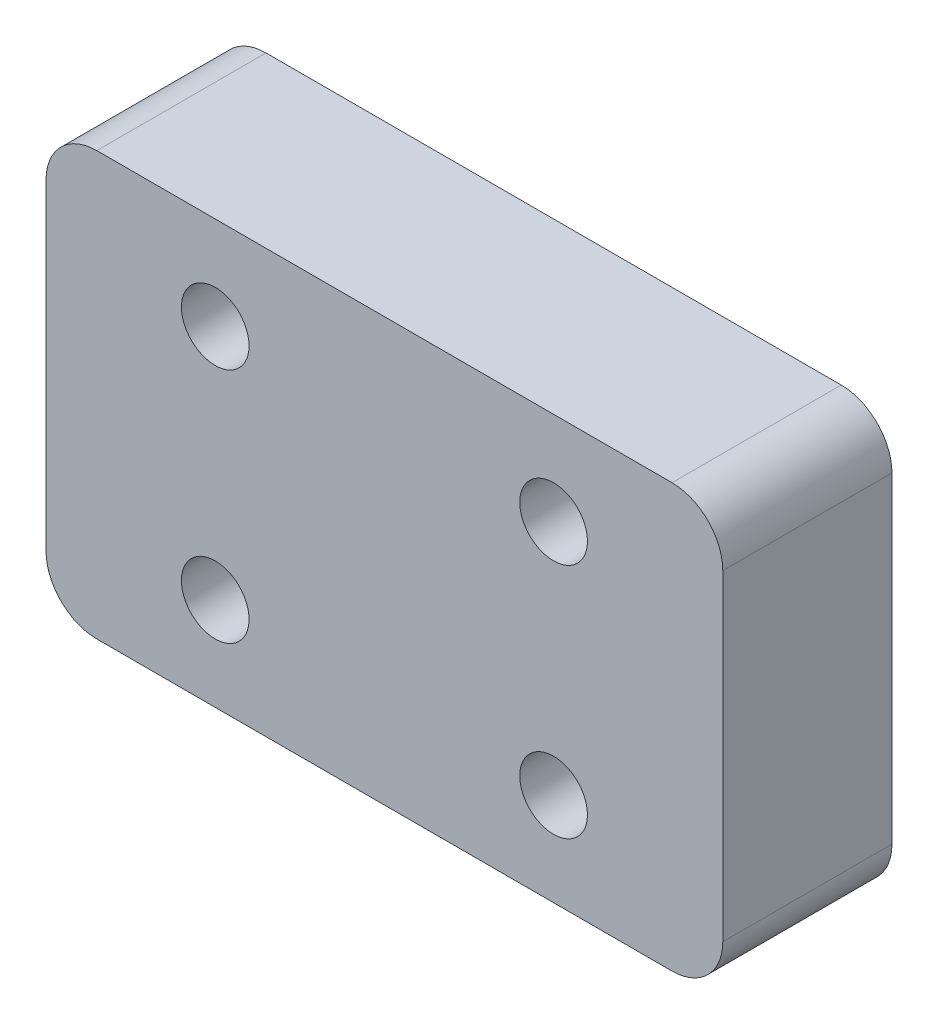
ISO-10303-21;
HEADER;
FILE_DESCRIPTION(('STEP AP214'),'2;1');
FILE_NAME('part.step','',(''),(''),'','','');
FILE_SCHEMA(('AUTOMOTIVE_DESIGN { 1 0 10303 214 1 1 1 1 }'));
ENDSEC;
DATA;
#1=APPLICATION_CONTEXT('core data for automotive mechanical design processes');
#2=APPLICATION_PROTOCOL_DEFINITION('international standard','automotive_design',2000,#1);
#3=PRODUCT_CONTEXT('',#1,'mechanical');
#4=PRODUCT('Part','Part','',(#3));
#5=PRODUCT_RELATED_PRODUCT_CATEGORY('part','',(#4));
#6=PRODUCT_DEFINITION_FORMATION('','',#4);
#7=PRODUCT_DEFINITION_CONTEXT('part definition',#1,'design');
#8=PRODUCT_DEFINITION('design','',#6,#7);
#9=PRODUCT_DEFINITION_SHAPE('','',#8);
#10=(LENGTH_UNIT() NAMED_UNIT(*) SI_UNIT(.MILLI.,.METRE.));
#11=(NAMED_UNIT(*) PLANE_ANGLE_UNIT() SI_UNIT($,.RADIAN.));
#12=(NAMED_UNIT(*) SI_UNIT($,.STERADIAN.) SOLID_ANGLE_UNIT());
#13=UNCERTAINTY_MEASURE_WITH_UNIT(LENGTH_MEASURE(1.E-05),#10,'distance_accuracy_value','');
#14=(GEOMETRIC_REPRESENTATION_CONTEXT(3) GLOBAL_UNCERTAINTY_ASSIGNED_CONTEXT((#13)) GLOBAL_UNIT_ASSIGNED_CONTEXT((#10,
#11,#12)) REPRESENTATION_CONTEXT('',''));
#15=CARTESIAN_POINT('',(0.,0.,0.));
#16=DIRECTION('',(0.,0.,1.));
#17=DIRECTION('',(1.,0.,0.));
#18=AXIS2_PLACEMENT_3D('',#15,#16,#17);
#19=CARTESIAN_POINT('',(-3.,22.,10.));
#20=DIRECTION('',(0.,0.,-1.));
#21=DIRECTION('',(-1.,0.,0.));
#22=AXIS2_PLACEMENT_3D('',#19,#20,#21);
#23=CYLINDRICAL_SURFACE('',#22,3.);
#24=CARTESIAN_POINT('',(-3.,22.,0.));
#25=DIRECTION('',(0.,0.,1.));
#26=DIRECTION('',(-1.,0.,0.));
#27=AXIS2_PLACEMENT_3D('',#24,#25,#26);
#28=CIRCLE('',#27,3.);
#29=CARTESIAN_POINT('',(0.,22.,0.));
#30=VERTEX_POINT('',#29);
#31=CARTESIAN_POINT('',(-3.,25.,0.));
#32=VERTEX_POINT('',#31);
#33=EDGE_CURVE('E137',#30,#32,#28,.T.);
#34=ORIENTED_EDGE('',*,*,#33,.T.);
#35=DIRECTION('',(0.,0.,-1.));
#36=VECTOR('',#35,1.);
#37=CARTESIAN_POINT('',(-3.,25.,10.));
#38=LINE('',#37,#36);
#39=CARTESIAN_POINT('',(-3.,25.,10.));
#40=VERTEX_POINT('',#39);
#41=EDGE_CURVE('E11',#40,#32,#38,.T.);
#42=ORIENTED_EDGE('',*,*,#41,.F.);
#43=CARTESIAN_POINT('',(-3.,22.,10.));
#44=DIRECTION('',(0.,0.,1.));
#45=DIRECTION('',(-1.,0.,0.));
#46=AXIS2_PLACEMENT_3D('',#43,#44,#45);
#47=CIRCLE('',#46,3.);
#48=CARTESIAN_POINT('',(0.,22.,10.));
#49=VERTEX_POINT('',#48);
#50=EDGE_CURVE('E152',#49,#40,#47,.T.);
#51=ORIENTED_EDGE('',*,*,#50,.F.);
#52=DIRECTION('',(0.,0.,-1.));
#53=VECTOR('',#52,1.);
#54=CARTESIAN_POINT('',(0.,22.,10.));
#55=LINE('',#54,#53);
#56=EDGE_CURVE('E133',#49,#30,#55,.T.);
#57=ORIENTED_EDGE('',*,*,#56,.T.);
#58=EDGE_LOOP('',(#34,#42,#51,#57));
#59=FACE_BOUND('',#58,.T.);
#60=ADVANCED_FACE('F41',(#59),#23,.T.);
#61=CARTESIAN_POINT('',(-3.,25.,10.));
#62=DIRECTION('',(0.,-1.,0.));
#63=DIRECTION('',(1.,0.,0.));
#64=AXIS2_PLACEMENT_3D('',#61,#62,#63);
#65=PLANE('',#64);
#66=DIRECTION('',(-1.,0.,0.));
#67=VECTOR('',#66,1.);
#68=CARTESIAN_POINT('',(-3.,25.,0.));
#69=LINE('',#68,#67);
#70=CARTESIAN_POINT('',(-37.,25.,0.));
#71=VERTEX_POINT('',#70);
#72=EDGE_CURVE('E140',#32,#71,#69,.T.);
#73=ORIENTED_EDGE('',*,*,#72,.T.);
#74=DIRECTION('',(0.,0.,-1.));
#75=VECTOR('',#74,1.);
#76=CARTESIAN_POINT('',(-37.,25.,10.));
#77=LINE('',#76,#75);
#78=CARTESIAN_POINT('',(-37.,25.,10.));
#79=VERTEX_POINT('',#78);
#80=EDGE_CURVE('E49',#79,#71,#77,.T.);
#81=ORIENTED_EDGE('',*,*,#80,.F.);
#82=DIRECTION('',(-1.,0.,0.));
#83=VECTOR('',#82,1.);
#84=CARTESIAN_POINT('',(-3.,25.,10.));
#85=LINE('',#84,#83);
#86=EDGE_CURVE('E100',#40,#79,#85,.T.);
#87=ORIENTED_EDGE('',*,*,#86,.F.);
#88=ORIENTED_EDGE('',*,*,#41,.T.);
#89=EDGE_LOOP('',(#73,#81,#87,#88));
#90=FACE_BOUND('',#89,.T.);
#91=ADVANCED_FACE('F237',(#90),#65,.F.);
#92=CARTESIAN_POINT('',(-37.,22.,10.));
#93=DIRECTION('',(0.,0.,-1.));
#94=DIRECTION('',(-1.,0.,0.));
#95=AXIS2_PLACEMENT_3D('',#92,#93,#94);
#96=CYLINDRICAL_SURFACE('',#95,3.);
#97=CARTESIAN_POINT('',(-37.,22.,0.));
#98=DIRECTION('',(0.,0.,1.));
#99=DIRECTION('',(-1.,0.,0.));
#100=AXIS2_PLACEMENT_3D('',#97,#98,#99);
#101=CIRCLE('',#100,3.);
#102=CARTESIAN_POINT('',(-40.,22.,0.));
#103=VERTEX_POINT('',#102);
#104=EDGE_CURVE('E143',#71,#103,#101,.T.);
#105=ORIENTED_EDGE('',*,*,#104,.T.);
#106=DIRECTION('',(0.,0.,-1.));
#107=VECTOR('',#106,1.);
#108=CARTESIAN_POINT('',(-40.,22.,10.));
#109=LINE('',#108,#107);
#110=CARTESIAN_POINT('',(-40.,22.,10.));
#111=VERTEX_POINT('',#110);
#112=EDGE_CURVE('E159',#111,#103,#109,.T.);
#113=ORIENTED_EDGE('',*,*,#112,.F.);
#114=CARTESIAN_POINT('',(-37.,22.,10.));
#115=DIRECTION('',(0.,0.,1.));
#116=DIRECTION('',(-1.,0.,0.));
#117=AXIS2_PLACEMENT_3D('',#114,#115,#116);
#118=CIRCLE('',#117,3.);
#119=EDGE_CURVE('E167',#79,#111,#118,.T.);
#120=ORIENTED_EDGE('',*,*,#119,.F.);
#121=ORIENTED_EDGE('',*,*,#80,.T.);
#122=EDGE_LOOP('',(#105,#113,#120,#121));
#123=FACE_BOUND('',#122,.T.);
#124=ADVANCED_FACE('F165',(#123),#96,.T.);
#125=CARTESIAN_POINT('',(-40.,3.,10.));
#126=DIRECTION('',(1.,0.,0.));
#127=DIRECTION('',(0.,1.,0.));
#128=AXIS2_PLACEMENT_3D('',#125,#126,#127);
#129=PLANE('',#128);
#130=DIRECTION('',(0.,-1.,0.));
#131=VECTOR('',#130,1.);
#132=CARTESIAN_POINT('',(-40.,3.,0.));
#133=LINE('',#132,#131);
#134=CARTESIAN_POINT('',(-40.,3.,0.));
#135=VERTEX_POINT('',#134);
#136=EDGE_CURVE('E145',#103,#135,#133,.T.);
#137=ORIENTED_EDGE('',*,*,#136,.T.);
#138=DIRECTION('',(0.,0.,-1.));
#139=VECTOR('',#138,1.);
#140=CARTESIAN_POINT('',(-40.,3.,10.));
#141=LINE('',#140,#139);
#142=CARTESIAN_POINT('',(-40.,3.,10.));
#143=VERTEX_POINT('',#142);
#144=EDGE_CURVE('E156',#143,#135,#141,.T.);
#145=ORIENTED_EDGE('',*,*,#144,.F.);
#146=DIRECTION('',(0.,-1.,0.));
#147=VECTOR('',#146,1.);
#148=CARTESIAN_POINT('',(-40.,3.,10.));
#149=LINE('',#148,#147);
#150=EDGE_CURVE('E179',#111,#143,#149,.T.);
#151=ORIENTED_EDGE('',*,*,#150,.F.);
#152=ORIENTED_EDGE('',*,*,#112,.T.);
#153=EDGE_LOOP('',(#137,#145,#151,#152));
#154=FACE_BOUND('',#153,.T.);
#155=ADVANCED_FACE('F175',(#154),#129,.F.);
#156=CARTESIAN_POINT('',(-37.,3.,10.));
#157=DIRECTION('',(0.,0.,-1.));
#158=DIRECTION('',(-1.,0.,0.));
#159=AXIS2_PLACEMENT_3D('',#156,#157,#158);
#160=CYLINDRICAL_SURFACE('',#159,3.);
#161=CARTESIAN_POINT('',(-37.,3.,0.));
#162=DIRECTION('',(0.,0.,1.));
#163=DIRECTION('',(-1.,0.,0.));
#164=AXIS2_PLACEMENT_3D('',#161,#162,#163);
#165=CIRCLE('',#164,3.);
#166=CARTESIAN_POINT('',(-37.,0.,0.));
#167=VERTEX_POINT('',#166);
#168=EDGE_CURVE('E147',#135,#167,#165,.T.);
#169=ORIENTED_EDGE('',*,*,#168,.T.);
#170=DIRECTION('',(0.,0.,-1.));
#171=VECTOR('',#170,1.);
#172=CARTESIAN_POINT('',(-37.,0.,10.));
#173=LINE('',#172,#171);
#174=CARTESIAN_POINT('',(-37.,0.,10.));
#175=VERTEX_POINT('',#174);
#176=EDGE_CURVE('E128',#175,#167,#173,.T.);
#177=ORIENTED_EDGE('',*,*,#176,.F.);
#178=CARTESIAN_POINT('',(-37.,3.,10.));
#179=DIRECTION('',(0.,0.,1.));
#180=DIRECTION('',(-1.,0.,0.));
#181=AXIS2_PLACEMENT_3D('',#178,#179,#180);
#182=CIRCLE('',#181,3.);
#183=EDGE_CURVE('E119',#143,#175,#182,.T.);
#184=ORIENTED_EDGE('',*,*,#183,.F.);
#185=ORIENTED_EDGE('',*,*,#144,.T.);
#186=EDGE_LOOP('',(#169,#177,#184,#185));
#187=FACE_BOUND('',#186,.T.);
#188=ADVANCED_FACE('F178',(#187),#160,.T.);
#189=CARTESIAN_POINT('',(-3.00000000000002,0.,10.));
#190=DIRECTION('',(0.,1.,0.));
#191=DIRECTION('',(-1.,0.,0.));
#192=AXIS2_PLACEMENT_3D('',#189,#190,#191);
#193=PLANE('',#192);
#194=DIRECTION('',(1.,0.,0.));
#195=VECTOR('',#194,1.);
#196=CARTESIAN_POINT('',(-3.00000000000002,0.,0.));
#197=LINE('',#196,#195);
#198=CARTESIAN_POINT('',(-3.00000000000002,0.,0.));
#199=VERTEX_POINT('',#198);
#200=EDGE_CURVE('E127',#167,#199,#197,.T.);
#201=ORIENTED_EDGE('',*,*,#200,.T.);
#202=DIRECTION('',(0.,0.,-1.));
#203=VECTOR('',#202,1.);
#204=CARTESIAN_POINT('',(-3.00000000000002,0.,10.));
#205=LINE('',#204,#203);
#206=CARTESIAN_POINT('',(-3.00000000000002,0.,10.));
#207=VERTEX_POINT('',#206);
#208=EDGE_CURVE('E124',#207,#199,#205,.T.);
#209=ORIENTED_EDGE('',*,*,#208,.F.);
#210=DIRECTION('',(1.,0.,0.));
#211=VECTOR('',#210,1.);
#212=CARTESIAN_POINT('',(-3.00000000000002,0.,10.));
#213=LINE('',#212,#211);
#214=EDGE_CURVE('E113',#175,#207,#213,.T.);
#215=ORIENTED_EDGE('',*,*,#214,.F.);
#216=ORIENTED_EDGE('',*,*,#176,.T.);
#217=EDGE_LOOP('',(#201,#209,#215,#216));
#218=FACE_BOUND('',#217,.T.);
#219=ADVANCED_FACE('F125',(#218),#193,.F.);
#220=CARTESIAN_POINT('',(-3.,3.,10.));
#221=DIRECTION('',(0.,0.,-1.));
#222=DIRECTION('',(-1.,0.,0.));
#223=AXIS2_PLACEMENT_3D('',#220,#221,#222);
#224=CYLINDRICAL_SURFACE('',#223,3.);
#225=CARTESIAN_POINT('',(-3.,3.,0.));
#226=DIRECTION('',(0.,0.,1.));
#227=DIRECTION('',(1.,0.,0.));
#228=AXIS2_PLACEMENT_3D('',#225,#226,#227);
#229=CIRCLE('',#228,3.);
#230=CARTESIAN_POINT('',(0.,3.,0.));
#231=VERTEX_POINT('',#230);
#232=EDGE_CURVE('E86',#199,#231,#229,.T.);
#233=ORIENTED_EDGE('',*,*,#232,.T.);
#234=DIRECTION('',(0.,0.,-1.));
#235=VECTOR('',#234,1.);
#236=CARTESIAN_POINT('',(0.,3.,10.));
#237=LINE('',#236,#235);
#238=CARTESIAN_POINT('',(0.,3.,10.));
#239=VERTEX_POINT('',#238);
#240=EDGE_CURVE('E129',#239,#231,#237,.T.);
#241=ORIENTED_EDGE('',*,*,#240,.F.);
#242=CARTESIAN_POINT('',(-3.,3.,10.));
#243=DIRECTION('',(0.,0.,1.));
#244=DIRECTION('',(1.,0.,0.));
#245=AXIS2_PLACEMENT_3D('',#242,#243,#244);
#246=CIRCLE('',#245,3.);
#247=EDGE_CURVE('E117',#207,#239,#246,.T.);
#248=ORIENTED_EDGE('',*,*,#247,.F.);
#249=ORIENTED_EDGE('',*,*,#208,.T.);
#250=EDGE_LOOP('',(#233,#241,#248,#249));
#251=FACE_BOUND('',#250,.T.);
#252=ADVANCED_FACE('F131',(#251),#224,.T.);
#253=CARTESIAN_POINT('',(0.,3.00000000000002,10.));
#254=DIRECTION('',(-1.,0.,0.));
#255=DIRECTION('',(0.,0.,1.));
#256=AXIS2_PLACEMENT_3D('',#253,#254,#255);
#257=PLANE('',#256);
#258=DIRECTION('',(0.,1.,0.));
#259=VECTOR('',#258,1.);
#260=CARTESIAN_POINT('',(0.,3.00000000000002,0.));
#261=LINE('',#260,#259);
#262=EDGE_CURVE('E92',#231,#30,#261,.T.);
#263=ORIENTED_EDGE('',*,*,#262,.T.);
#264=ORIENTED_EDGE('',*,*,#56,.F.);
#265=DIRECTION('',(0.,1.,0.));
#266=VECTOR('',#265,1.);
#267=CARTESIAN_POINT('',(0.,3.00000000000002,10.));
#268=LINE('',#267,#266);
#269=EDGE_CURVE('E57',#239,#49,#268,.T.);
#270=ORIENTED_EDGE('',*,*,#269,.F.);
#271=ORIENTED_EDGE('',*,*,#240,.T.);
#272=EDGE_LOOP('',(#263,#264,#270,#271));
#273=FACE_BOUND('',#272,.T.);
#274=ADVANCED_FACE('F221',(#273),#257,.F.);
#275=CARTESIAN_POINT('',(-3.,22.,10.));
#276=DIRECTION('',(0.,0.,-1.));
#277=DIRECTION('',(-1.,0.,0.));
#278=AXIS2_PLACEMENT_3D('',#275,#276,#277);
#279=PLANE('',#278);
#280=CARTESIAN_POINT('',(-30.,5.5,10.));
#281=DIRECTION('',(0.,0.,1.));
#282=DIRECTION('',(-1.,0.,0.));
#283=AXIS2_PLACEMENT_3D('',#280,#281,#282);
#284=CIRCLE('',#283,2.);
#285=CARTESIAN_POINT('',(-32.,5.5,10.));
#286=VERTEX_POINT('',#285);
#287=EDGE_CURVE('E198',#286,#286,#284,.T.);
#288=ORIENTED_EDGE('',*,*,#287,.F.);
#289=EDGE_LOOP('',(#288));
#290=FACE_BOUND('',#289,.T.);
#291=CARTESIAN_POINT('',(-9.99999999999999,19.5,10.));
#292=DIRECTION('',(0.,0.,1.));
#293=DIRECTION('',(-1.,0.,0.));
#294=AXIS2_PLACEMENT_3D('',#291,#292,#293);
#295=CIRCLE('',#294,2.);
#296=CARTESIAN_POINT('',(-12.,19.5,10.));
#297=VERTEX_POINT('',#296);
#298=EDGE_CURVE('E191',#297,#297,#295,.T.);
#299=ORIENTED_EDGE('',*,*,#298,.F.);
#300=EDGE_LOOP('',(#299));
#301=FACE_BOUND('',#300,.T.);
#302=CARTESIAN_POINT('',(-9.99999999999999,5.5,10.));
#303=DIRECTION('',(0.,0.,1.));
#304=DIRECTION('',(1.,0.,0.));
#305=AXIS2_PLACEMENT_3D('',#302,#303,#304);
#306=CIRCLE('',#305,2.);
#307=CARTESIAN_POINT('',(-7.99999999999999,5.5,10.));
#308=VERTEX_POINT('',#307);
#309=EDGE_CURVE('E203',#308,#308,#306,.T.);
#310=ORIENTED_EDGE('',*,*,#309,.F.);
#311=EDGE_LOOP('',(#310));
#312=FACE_BOUND('',#311,.T.);
#313=CARTESIAN_POINT('',(-30.,19.5,10.));
#314=DIRECTION('',(0.,0.,1.));
#315=DIRECTION('',(1.,0.,0.));
#316=AXIS2_PLACEMENT_3D('',#313,#314,#315);
#317=CIRCLE('',#316,2.);
#318=CARTESIAN_POINT('',(-28.,19.5,10.));
#319=VERTEX_POINT('',#318);
#320=EDGE_CURVE('E141',#319,#319,#317,.T.);
#321=ORIENTED_EDGE('',*,*,#320,.F.);
#322=EDGE_LOOP('',(#321));
#323=FACE_BOUND('',#322,.T.);
#324=ORIENTED_EDGE('',*,*,#50,.T.);
#325=ORIENTED_EDGE('',*,*,#86,.T.);
#326=ORIENTED_EDGE('',*,*,#119,.T.);
#327=ORIENTED_EDGE('',*,*,#150,.T.);
#328=ORIENTED_EDGE('',*,*,#183,.T.);
#329=ORIENTED_EDGE('',*,*,#214,.T.);
#330=ORIENTED_EDGE('',*,*,#247,.T.);
#331=ORIENTED_EDGE('',*,*,#269,.T.);
#332=EDGE_LOOP('',(#324,#325,#326,#327,#328,#329,#330,#331));
#333=FACE_BOUND('',#332,.T.);
#334=ADVANCED_FACE('F115',(#290,#301,#312,#323,#333),#279,.F.);
#335=CARTESIAN_POINT('',(-3.,22.,0.));
#336=DIRECTION('',(0.,0.,-1.));
#337=DIRECTION('',(-1.,0.,0.));
#338=AXIS2_PLACEMENT_3D('',#335,#336,#337);
#339=PLANE('',#338);
#340=CARTESIAN_POINT('',(-30.,5.5,0.));
#341=DIRECTION('',(0.,0.,-1.));
#342=DIRECTION('',(-1.,0.,0.));
#343=AXIS2_PLACEMENT_3D('',#340,#341,#342);
#344=CIRCLE('',#343,2.);
#345=CARTESIAN_POINT('',(-32.,5.5,0.));
#346=VERTEX_POINT('',#345);
#347=EDGE_CURVE('E188',#346,#346,#344,.F.);
#348=ORIENTED_EDGE('',*,*,#347,.T.);
#349=EDGE_LOOP('',(#348));
#350=FACE_BOUND('',#349,.T.);
#351=CARTESIAN_POINT('',(-9.99999999999999,19.5,0.));
#352=DIRECTION('',(0.,0.,-1.));
#353=DIRECTION('',(-1.,0.,0.));
#354=AXIS2_PLACEMENT_3D('',#351,#352,#353);
#355=CIRCLE('',#354,2.);
#356=CARTESIAN_POINT('',(-12.,19.5,0.));
#357=VERTEX_POINT('',#356);
#358=EDGE_CURVE('E194',#357,#357,#355,.F.);
#359=ORIENTED_EDGE('',*,*,#358,.T.);
#360=EDGE_LOOP('',(#359));
#361=FACE_BOUND('',#360,.T.);
#362=CARTESIAN_POINT('',(-9.99999999999999,5.5,0.));
#363=DIRECTION('',(0.,0.,-1.));
#364=DIRECTION('',(-1.,0.,0.));
#365=AXIS2_PLACEMENT_3D('',#362,#363,#364);
#366=CIRCLE('',#365,2.);
#367=CARTESIAN_POINT('',(-12.,5.5,0.));
#368=VERTEX_POINT('',#367);
#369=EDGE_CURVE('E195',#368,#368,#366,.F.);
#370=ORIENTED_EDGE('',*,*,#369,.T.);
#371=EDGE_LOOP('',(#370));
#372=FACE_BOUND('',#371,.T.);
#373=CARTESIAN_POINT('',(-30.,19.5,0.));
#374=DIRECTION('',(0.,0.,-1.));
#375=DIRECTION('',(-1.,0.,0.));
#376=AXIS2_PLACEMENT_3D('',#373,#374,#375);
#377=CIRCLE('',#376,2.);
#378=CARTESIAN_POINT('',(-32.,19.5,0.));
#379=VERTEX_POINT('',#378);
#380=EDGE_CURVE('E185',#379,#379,#377,.F.);
#381=ORIENTED_EDGE('',*,*,#380,.T.);
#382=EDGE_LOOP('',(#381));
#383=FACE_BOUND('',#382,.T.);
#384=ORIENTED_EDGE('',*,*,#33,.F.);
#385=ORIENTED_EDGE('',*,*,#262,.F.);
#386=ORIENTED_EDGE('',*,*,#232,.F.);
#387=ORIENTED_EDGE('',*,*,#200,.F.);
#388=ORIENTED_EDGE('',*,*,#168,.F.);
#389=ORIENTED_EDGE('',*,*,#136,.F.);
#390=ORIENTED_EDGE('',*,*,#104,.F.);
#391=ORIENTED_EDGE('',*,*,#72,.F.);
#392=EDGE_LOOP('',(#384,#385,#386,#387,#388,#389,#390,#391));
#393=FACE_BOUND('',#392,.T.);
#394=ADVANCED_FACE('F171',(#350,#361,#372,#383,#393),#339,.T.);
#395=CARTESIAN_POINT('',(-30.,19.5,-0.000999999999999265));
#396=DIRECTION('',(0.,0.,1.));
#397=DIRECTION('',(1.,0.,0.));
#398=AXIS2_PLACEMENT_3D('',#395,#396,#397);
#399=CYLINDRICAL_SURFACE('',#398,2.);
#400=ORIENTED_EDGE('',*,*,#380,.F.);
#401=EDGE_LOOP('',(#400));
#402=FACE_BOUND('',#401,.T.);
#403=ORIENTED_EDGE('',*,*,#320,.T.);
#404=EDGE_LOOP('',(#403));
#405=FACE_BOUND('',#404,.T.);
#406=ADVANCED_FACE('F215',(#402,#405),#399,.F.);
#407=CARTESIAN_POINT('',(-9.99999999999999,5.5,-0.000999999999999265));
#408=DIRECTION('',(0.,0.,1.));
#409=DIRECTION('',(1.,0.,0.));
#410=AXIS2_PLACEMENT_3D('',#407,#408,#409);
#411=CYLINDRICAL_SURFACE('',#410,2.);
#412=ORIENTED_EDGE('',*,*,#369,.F.);
#413=EDGE_LOOP('',(#412));
#414=FACE_BOUND('',#413,.T.);
#415=ORIENTED_EDGE('',*,*,#309,.T.);
#416=EDGE_LOOP('',(#415));
#417=FACE_BOUND('',#416,.T.);
#418=ADVANCED_FACE('F211',(#414,#417),#411,.F.);
#419=CARTESIAN_POINT('',(-9.99999999999999,19.5,-0.000999999999999265));
#420=DIRECTION('',(0.,0.,1.));
#421=DIRECTION('',(1.,0.,0.));
#422=AXIS2_PLACEMENT_3D('',#419,#420,#421);
#423=CYLINDRICAL_SURFACE('',#422,2.);
#424=ORIENTED_EDGE('',*,*,#358,.F.);
#425=EDGE_LOOP('',(#424));
#426=FACE_BOUND('',#425,.T.);
#427=ORIENTED_EDGE('',*,*,#298,.T.);
#428=EDGE_LOOP('',(#427));
#429=FACE_BOUND('',#428,.T.);
#430=ADVANCED_FACE('F214',(#426,#429),#423,.F.);
#431=CARTESIAN_POINT('',(-30.,5.5,-0.000999999999999265));
#432=DIRECTION('',(0.,0.,1.));
#433=DIRECTION('',(1.,0.,0.));
#434=AXIS2_PLACEMENT_3D('',#431,#432,#433);
#435=CYLINDRICAL_SURFACE('',#434,2.);
#436=ORIENTED_EDGE('',*,*,#347,.F.);
#437=EDGE_LOOP('',(#436));
#438=FACE_BOUND('',#437,.T.);
#439=ORIENTED_EDGE('',*,*,#287,.T.);
#440=EDGE_LOOP('',(#439));
#441=FACE_BOUND('',#440,.T.);
#442=ADVANCED_FACE('F318',(#438,#441),#435,.F.);
#443=CLOSED_SHELL('',(#60,#91,#124,#155,#188,#219,#252,#274,#334,#394,#406,#418,#430,#442));
#444=MANIFOLD_SOLID_BREP('B2',#443);
#445=ADVANCED_BREP_SHAPE_REPRESENTATION('',(#18,#444),#14);
#446=SHAPE_DEFINITION_REPRESENTATION(#9,#445);
ENDSEC;
END-ISO-10303-21;
